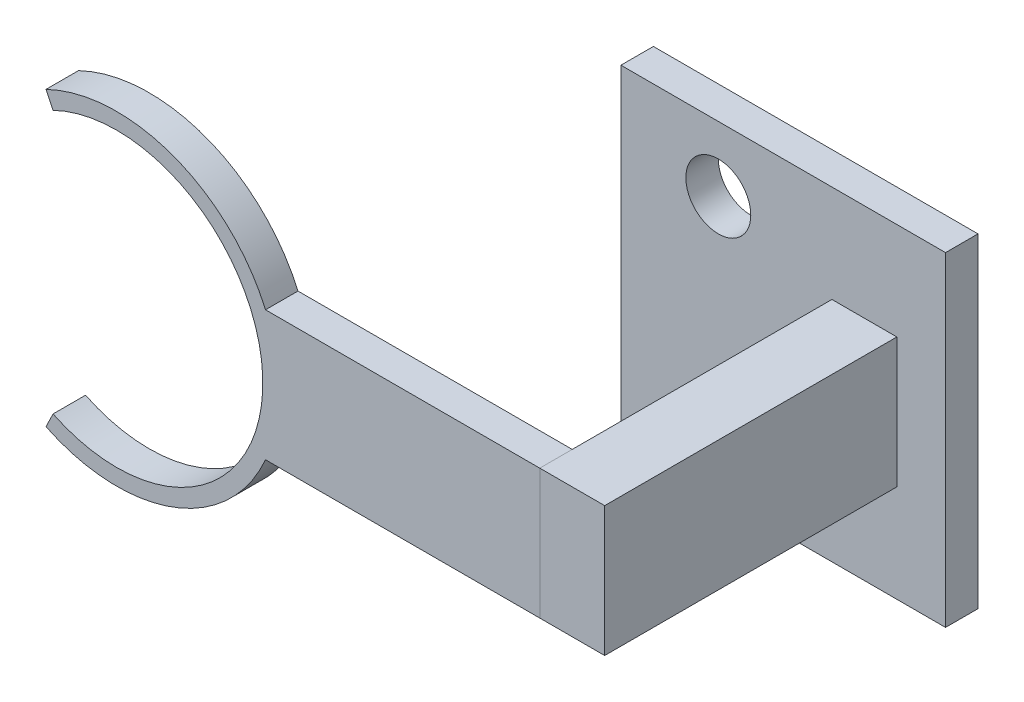
ISO-10303-21;
HEADER;
FILE_DESCRIPTION(('STEP AP214'),'2;1');
FILE_NAME('part.step','',(''),(''),'','','');
FILE_SCHEMA(('AUTOMOTIVE_DESIGN { 1 0 10303 214 1 1 1 1 }'));
ENDSEC;
DATA;
#1=APPLICATION_CONTEXT('core data for automotive mechanical design processes');
#2=APPLICATION_PROTOCOL_DEFINITION('international standard','automotive_design',2000,#1);
#3=PRODUCT_CONTEXT('',#1,'mechanical');
#4=PRODUCT('Part','Part','',(#3));
#5=PRODUCT_RELATED_PRODUCT_CATEGORY('part','',(#4));
#6=PRODUCT_DEFINITION_FORMATION('','',#4);
#7=PRODUCT_DEFINITION_CONTEXT('part definition',#1,'design');
#8=PRODUCT_DEFINITION('design','',#6,#7);
#9=PRODUCT_DEFINITION_SHAPE('','',#8);
#10=(LENGTH_UNIT() NAMED_UNIT(*) SI_UNIT(.MILLI.,.METRE.));
#11=(NAMED_UNIT(*) PLANE_ANGLE_UNIT() SI_UNIT($,.RADIAN.));
#12=(NAMED_UNIT(*) SI_UNIT($,.STERADIAN.) SOLID_ANGLE_UNIT());
#13=UNCERTAINTY_MEASURE_WITH_UNIT(LENGTH_MEASURE(1.E-05),#10,'distance_accuracy_value','');
#14=(GEOMETRIC_REPRESENTATION_CONTEXT(3) GLOBAL_UNCERTAINTY_ASSIGNED_CONTEXT((#13)) GLOBAL_UNIT_ASSIGNED_CONTEXT((#10,
#11,#12)) REPRESENTATION_CONTEXT('',''));
#15=CARTESIAN_POINT('',(0.,0.,0.));
#16=DIRECTION('',(0.,0.,1.));
#17=DIRECTION('',(1.,0.,0.));
#18=AXIS2_PLACEMENT_3D('',#15,#16,#17);
#19=CARTESIAN_POINT('',(-23.0622577482985,0.,18.));
#20=DIRECTION('',(0.,0.,1.));
#21=DIRECTION('',(1.,0.,0.));
#22=AXIS2_PLACEMENT_3D('',#19,#20,#21);
#23=CYLINDRICAL_SURFACE('',#22,9.);
#24=CARTESIAN_POINT('',(-23.0622577482985,0.,20.));
#25=DIRECTION('',(0.,0.,1.));
#26=DIRECTION('',(1.,0.,0.));
#27=AXIS2_PLACEMENT_3D('',#24,#25,#26);
#28=CIRCLE('',#27,9.);
#29=CARTESIAN_POINT('',(-26.9852667974851,-8.1,20.));
#30=VERTEX_POINT('',#29);
#31=CARTESIAN_POINT('',(-26.9852667974852,8.1,20.));
#32=VERTEX_POINT('',#31);
#33=EDGE_CURVE('E139',#30,#32,#28,.T.);
#34=ORIENTED_EDGE('',*,*,#33,.T.);
#35=DIRECTION('',(0.,0.,1.));
#36=VECTOR('',#35,1.);
#37=CARTESIAN_POINT('',(-26.9852667974852,8.1,18.));
#38=LINE('',#37,#36);
#39=CARTESIAN_POINT('',(-26.9852667974852,8.1,18.));
#40=VERTEX_POINT('',#39);
#41=EDGE_CURVE('E12',#40,#32,#38,.T.);
#42=ORIENTED_EDGE('',*,*,#41,.F.);
#43=CARTESIAN_POINT('',(-23.0622577482985,0.,18.));
#44=DIRECTION('',(0.,0.,1.));
#45=DIRECTION('',(1.,0.,0.));
#46=AXIS2_PLACEMENT_3D('',#43,#44,#45);
#47=CIRCLE('',#46,9.);
#48=CARTESIAN_POINT('',(-26.9852667974851,-8.1,18.));
#49=VERTEX_POINT('',#48);
#50=EDGE_CURVE('E157',#49,#40,#47,.T.);
#51=ORIENTED_EDGE('',*,*,#50,.F.);
#52=DIRECTION('',(0.,0.,1.));
#53=VECTOR('',#52,1.);
#54=CARTESIAN_POINT('',(-26.9852667974851,-8.1,18.));
#55=LINE('',#54,#53);
#56=EDGE_CURVE('E48',#49,#30,#55,.T.);
#57=ORIENTED_EDGE('',*,*,#56,.T.);
#58=EDGE_LOOP('',(#34,#42,#51,#57));
#59=FACE_BOUND('',#58,.T.);
#60=ADVANCED_FACE('F45',(#59),#23,.F.);
#61=CARTESIAN_POINT('',(-18.6804287761217,-9.04734458412496,18.));
#62=DIRECTION('',(0.899999999999998,0.435889894354072,0.));
#63=DIRECTION('',(-0.435889894354072,0.899999999999998,0.));
#64=AXIS2_PLACEMENT_3D('',#61,#62,#63);
#65=PLANE('',#64);
#66=DIRECTION('',(-0.435889894354072,0.899999999999998,0.));
#67=VECTOR('',#66,1.);
#68=CARTESIAN_POINT('',(-18.6804287761217,-9.04734458412496,20.));
#69=LINE('',#68,#67);
#70=CARTESIAN_POINT('',(-27.4211566918392,9.,20.));
#71=VERTEX_POINT('',#70);
#72=EDGE_CURVE('E96',#32,#71,#69,.T.);
#73=ORIENTED_EDGE('',*,*,#72,.T.);
#74=DIRECTION('',(0.,0.,1.));
#75=VECTOR('',#74,1.);
#76=CARTESIAN_POINT('',(-27.4211566918392,9.,18.));
#77=LINE('',#76,#75);
#78=CARTESIAN_POINT('',(-27.4211566918392,9.,18.));
#79=VERTEX_POINT('',#78);
#80=EDGE_CURVE('E54',#79,#71,#77,.T.);
#81=ORIENTED_EDGE('',*,*,#80,.F.);
#82=DIRECTION('',(-0.435889894354072,0.899999999999998,0.));
#83=VECTOR('',#82,1.);
#84=CARTESIAN_POINT('',(-18.6804287761217,-9.04734458412496,18.));
#85=LINE('',#84,#83);
#86=EDGE_CURVE('E62',#40,#79,#85,.T.);
#87=ORIENTED_EDGE('',*,*,#86,.F.);
#88=ORIENTED_EDGE('',*,*,#41,.T.);
#89=EDGE_LOOP('',(#73,#81,#87,#88));
#90=FACE_BOUND('',#89,.T.);
#91=ADVANCED_FACE('F182',(#90),#65,.F.);
#92=CARTESIAN_POINT('',(-23.0622577482985,0.,18.));
#93=DIRECTION('',(0.,0.,1.));
#94=DIRECTION('',(1.,0.,0.));
#95=AXIS2_PLACEMENT_3D('',#92,#93,#94);
#96=CYLINDRICAL_SURFACE('',#95,10.);
#97=CARTESIAN_POINT('',(-23.0622577482985,0.,20.));
#98=DIRECTION('',(0.,0.,1.));
#99=DIRECTION('',(1.,0.,0.));
#100=AXIS2_PLACEMENT_3D('',#97,#98,#99);
#101=CIRCLE('',#100,10.);
#102=CARTESIAN_POINT('',(-13.8971063583869,4.,20.));
#103=VERTEX_POINT('',#102);
#104=EDGE_CURVE('E121',#103,#71,#101,.T.);
#105=ORIENTED_EDGE('',*,*,#104,.F.);
#106=DIRECTION('',(0.,0.,1.));
#107=VECTOR('',#106,1.);
#108=CARTESIAN_POINT('',(-13.8971063583869,4.,18.));
#109=LINE('',#108,#107);
#110=CARTESIAN_POINT('',(-13.8971063583869,4.,18.));
#111=VERTEX_POINT('',#110);
#112=EDGE_CURVE('E116',#111,#103,#109,.T.);
#113=ORIENTED_EDGE('',*,*,#112,.F.);
#114=CARTESIAN_POINT('',(-23.0622577482985,0.,18.));
#115=DIRECTION('',(0.,0.,1.));
#116=DIRECTION('',(1.,0.,0.));
#117=AXIS2_PLACEMENT_3D('',#114,#115,#116);
#118=CIRCLE('',#117,10.);
#119=EDGE_CURVE('E120',#111,#79,#118,.T.);
#120=ORIENTED_EDGE('',*,*,#119,.T.);
#121=ORIENTED_EDGE('',*,*,#80,.T.);
#122=EDGE_LOOP('',(#105,#113,#120,#121));
#123=FACE_BOUND('',#122,.T.);
#124=ADVANCED_FACE('F118',(#123),#96,.T.);
#125=CARTESIAN_POINT('',(0.,4.,18.));
#126=DIRECTION('',(0.,-1.,0.));
#127=DIRECTION('',(1.,0.,0.));
#128=AXIS2_PLACEMENT_3D('',#125,#126,#127);
#129=PLANE('',#128);
#130=DIRECTION('',(1.,0.,0.));
#131=VECTOR('',#130,1.);
#132=CARTESIAN_POINT('',(0.,4.,20.));
#133=LINE('',#132,#131);
#134=CARTESIAN_POINT('',(3.,4.,20.));
#135=VERTEX_POINT('',#134);
#136=EDGE_CURVE('E154',#103,#135,#133,.T.);
#137=ORIENTED_EDGE('',*,*,#136,.T.);
#138=DIRECTION('',(0.,0.,1.));
#139=VECTOR('',#138,1.);
#140=CARTESIAN_POINT('',(3.,4.,18.));
#141=LINE('',#140,#139);
#142=CARTESIAN_POINT('',(3.,4.,18.));
#143=VERTEX_POINT('',#142);
#144=EDGE_CURVE('E124',#143,#135,#141,.T.);
#145=ORIENTED_EDGE('',*,*,#144,.F.);
#146=DIRECTION('',(1.,0.,0.));
#147=VECTOR('',#146,1.);
#148=CARTESIAN_POINT('',(0.,4.,18.));
#149=LINE('',#148,#147);
#150=EDGE_CURVE('E127',#111,#143,#149,.T.);
#151=ORIENTED_EDGE('',*,*,#150,.F.);
#152=ORIENTED_EDGE('',*,*,#112,.T.);
#153=EDGE_LOOP('',(#137,#145,#151,#152));
#154=FACE_BOUND('',#153,.T.);
#155=ADVANCED_FACE('F128',(#154),#129,.F.);
#156=CARTESIAN_POINT('',(3.,0.,18.));
#157=DIRECTION('',(-1.,0.,0.));
#158=DIRECTION('',(0.,-1.,0.));
#159=AXIS2_PLACEMENT_3D('',#156,#157,#158);
#160=PLANE('',#159);
#161=DIRECTION('',(0.,-1.,0.));
#162=VECTOR('',#161,1.);
#163=CARTESIAN_POINT('',(3.,0.,20.));
#164=LINE('',#163,#162);
#165=CARTESIAN_POINT('',(3.,-4.,20.));
#166=VERTEX_POINT('',#165);
#167=EDGE_CURVE('E151',#135,#166,#164,.T.);
#168=ORIENTED_EDGE('',*,*,#167,.T.);
#169=DIRECTION('',(0.,0.,1.));
#170=VECTOR('',#169,1.);
#171=CARTESIAN_POINT('',(3.,-4.,18.));
#172=LINE('',#171,#170);
#173=CARTESIAN_POINT('',(3.,-4.,18.));
#174=VERTEX_POINT('',#173);
#175=EDGE_CURVE('E161',#174,#166,#172,.T.);
#176=ORIENTED_EDGE('',*,*,#175,.F.);
#177=DIRECTION('',(0.,-1.,0.));
#178=VECTOR('',#177,1.);
#179=CARTESIAN_POINT('',(3.,0.,18.));
#180=LINE('',#179,#178);
#181=EDGE_CURVE('E132',#143,#174,#180,.T.);
#182=ORIENTED_EDGE('',*,*,#181,.F.);
#183=ORIENTED_EDGE('',*,*,#144,.T.);
#184=EDGE_LOOP('',(#168,#176,#182,#183));
#185=FACE_BOUND('',#184,.T.);
#186=ADVANCED_FACE('F195',(#185),#160,.F.);
#187=CARTESIAN_POINT('',(0.,-4.,18.));
#188=DIRECTION('',(0.,-1.,0.));
#189=DIRECTION('',(0.,0.,-1.));
#190=AXIS2_PLACEMENT_3D('',#187,#188,#189);
#191=PLANE('',#190);
#192=DIRECTION('',(1.,0.,0.));
#193=VECTOR('',#192,1.);
#194=CARTESIAN_POINT('',(0.,-4.,20.));
#195=LINE('',#194,#193);
#196=CARTESIAN_POINT('',(-13.8971063583869,-4.,20.));
#197=VERTEX_POINT('',#196);
#198=EDGE_CURVE('E148',#197,#166,#195,.T.);
#199=ORIENTED_EDGE('',*,*,#198,.F.);
#200=DIRECTION('',(0.,0.,1.));
#201=VECTOR('',#200,1.);
#202=CARTESIAN_POINT('',(-13.8971063583869,-4.,18.));
#203=LINE('',#202,#201);
#204=CARTESIAN_POINT('',(-13.8971063583869,-4.,18.));
#205=VERTEX_POINT('',#204);
#206=EDGE_CURVE('E163',#205,#197,#203,.T.);
#207=ORIENTED_EDGE('',*,*,#206,.F.);
#208=DIRECTION('',(1.,0.,0.));
#209=VECTOR('',#208,1.);
#210=CARTESIAN_POINT('',(0.,-4.,18.));
#211=LINE('',#210,#209);
#212=EDGE_CURVE('E211',#205,#174,#211,.T.);
#213=ORIENTED_EDGE('',*,*,#212,.T.);
#214=ORIENTED_EDGE('',*,*,#175,.T.);
#215=EDGE_LOOP('',(#199,#207,#213,#214));
#216=FACE_BOUND('',#215,.T.);
#217=ADVANCED_FACE('F178',(#216),#191,.T.);
#218=CARTESIAN_POINT('',(-23.0622577482985,0.,18.));
#219=DIRECTION('',(0.,0.,1.));
#220=DIRECTION('',(1.,0.,0.));
#221=AXIS2_PLACEMENT_3D('',#218,#219,#220);
#222=CYLINDRICAL_SURFACE('',#221,10.);
#223=CARTESIAN_POINT('',(-23.0622577482985,0.,20.));
#224=DIRECTION('',(0.,0.,1.));
#225=DIRECTION('',(1.,0.,0.));
#226=AXIS2_PLACEMENT_3D('',#223,#224,#225);
#227=CIRCLE('',#226,10.);
#228=CARTESIAN_POINT('',(-27.4211566918392,-9.,20.));
#229=VERTEX_POINT('',#228);
#230=EDGE_CURVE('E145',#229,#197,#227,.T.);
#231=ORIENTED_EDGE('',*,*,#230,.F.);
#232=DIRECTION('',(0.,0.,1.));
#233=VECTOR('',#232,1.);
#234=CARTESIAN_POINT('',(-27.4211566918392,-9.,18.));
#235=LINE('',#234,#233);
#236=CARTESIAN_POINT('',(-27.4211566918392,-9.,18.));
#237=VERTEX_POINT('',#236);
#238=EDGE_CURVE('E164',#237,#229,#235,.T.);
#239=ORIENTED_EDGE('',*,*,#238,.F.);
#240=CARTESIAN_POINT('',(-23.0622577482985,0.,18.));
#241=DIRECTION('',(0.,0.,1.));
#242=DIRECTION('',(1.,0.,0.));
#243=AXIS2_PLACEMENT_3D('',#240,#241,#242);
#244=CIRCLE('',#243,10.);
#245=EDGE_CURVE('E210',#237,#205,#244,.T.);
#246=ORIENTED_EDGE('',*,*,#245,.T.);
#247=ORIENTED_EDGE('',*,*,#206,.T.);
#248=EDGE_LOOP('',(#231,#239,#246,#247));
#249=FACE_BOUND('',#248,.T.);
#250=ADVANCED_FACE('F172',(#249),#222,.T.);
#251=CARTESIAN_POINT('',(-18.6804287761217,9.04734458412495,18.));
#252=DIRECTION('',(-0.899999999999998,0.435889894354071,0.));
#253=DIRECTION('',(-0.435889894354071,-0.899999999999998,0.));
#254=AXIS2_PLACEMENT_3D('',#251,#252,#253);
#255=PLANE('',#254);
#256=DIRECTION('',(-0.435889894354071,-0.899999999999998,0.));
#257=VECTOR('',#256,1.);
#258=CARTESIAN_POINT('',(-18.6804287761217,9.04734458412495,20.));
#259=LINE('',#258,#257);
#260=EDGE_CURVE('E142',#30,#229,#259,.T.);
#261=ORIENTED_EDGE('',*,*,#260,.F.);
#262=ORIENTED_EDGE('',*,*,#56,.F.);
#263=DIRECTION('',(-0.435889894354071,-0.899999999999998,0.));
#264=VECTOR('',#263,1.);
#265=CARTESIAN_POINT('',(-18.6804287761217,9.04734458412495,18.));
#266=LINE('',#265,#264);
#267=EDGE_CURVE('E212',#49,#237,#266,.T.);
#268=ORIENTED_EDGE('',*,*,#267,.T.);
#269=ORIENTED_EDGE('',*,*,#238,.T.);
#270=EDGE_LOOP('',(#261,#262,#268,#269));
#271=FACE_BOUND('',#270,.T.);
#272=ADVANCED_FACE('F170',(#271),#255,.T.);
#273=CARTESIAN_POINT('',(0.,0.,18.));
#274=DIRECTION('',(0.,0.,1.));
#275=DIRECTION('',(1.,0.,0.));
#276=AXIS2_PLACEMENT_3D('',#273,#274,#275);
#277=PLANE('',#276);
#278=ORIENTED_EDGE('',*,*,#50,.T.);
#279=ORIENTED_EDGE('',*,*,#86,.T.);
#280=ORIENTED_EDGE('',*,*,#119,.F.);
#281=ORIENTED_EDGE('',*,*,#150,.T.);
#282=ORIENTED_EDGE('',*,*,#181,.T.);
#283=ORIENTED_EDGE('',*,*,#212,.F.);
#284=ORIENTED_EDGE('',*,*,#245,.F.);
#285=ORIENTED_EDGE('',*,*,#267,.F.);
#286=EDGE_LOOP('',(#278,#279,#280,#281,#282,#283,#284,#285));
#287=FACE_BOUND('',#286,.T.);
#288=ADVANCED_FACE('F134',(#287),#277,.F.);
#289=CARTESIAN_POINT('',(0.,0.,20.));
#290=DIRECTION('',(0.,0.,1.));
#291=DIRECTION('',(1.,0.,0.));
#292=AXIS2_PLACEMENT_3D('',#289,#290,#291);
#293=PLANE('',#292);
#294=ORIENTED_EDGE('',*,*,#33,.F.);
#295=ORIENTED_EDGE('',*,*,#260,.T.);
#296=ORIENTED_EDGE('',*,*,#230,.T.);
#297=ORIENTED_EDGE('',*,*,#198,.T.);
#298=ORIENTED_EDGE('',*,*,#167,.F.);
#299=ORIENTED_EDGE('',*,*,#136,.F.);
#300=ORIENTED_EDGE('',*,*,#104,.T.);
#301=ORIENTED_EDGE('',*,*,#72,.F.);
#302=EDGE_LOOP('',(#294,#295,#296,#297,#298,#299,#300,#301));
#303=FACE_BOUND('',#302,.T.);
#304=ADVANCED_FACE('F169',(#303),#293,.T.);
#305=CLOSED_SHELL('',(#60,#91,#124,#155,#186,#217,#250,#272,#288,#304));
#306=MANIFOLD_SOLID_BREP('B2',#305);
#307=CARTESIAN_POINT('',(0.,0.,2.));
#308=DIRECTION('',(0.,0.,-1.));
#309=DIRECTION('',(-1.,0.,0.));
#310=AXIS2_PLACEMENT_3D('',#307,#308,#309);
#311=PLANE('',#310);
#312=CARTESIAN_POINT('',(-4.,-6.,2.));
#313=DIRECTION('',(0.,0.,1.));
#314=DIRECTION('',(-1.,0.,0.));
#315=AXIS2_PLACEMENT_3D('',#312,#313,#314);
#316=CIRCLE('',#315,2.);
#317=CARTESIAN_POINT('',(-6.,-6.,2.));
#318=VERTEX_POINT('',#317);
#319=EDGE_CURVE('E396',#318,#318,#316,.T.);
#320=ORIENTED_EDGE('',*,*,#319,.F.);
#321=EDGE_LOOP('',(#320));
#322=FACE_BOUND('',#321,.T.);
#323=CARTESIAN_POINT('',(-4.00000000000001,6.,2.));
#324=DIRECTION('',(0.,0.,1.));
#325=DIRECTION('',(1.,0.,0.));
#326=AXIS2_PLACEMENT_3D('',#323,#324,#325);
#327=CIRCLE('',#326,2.);
#328=CARTESIAN_POINT('',(-2.00000000000001,6.,2.));
#329=VERTEX_POINT('',#328);
#330=EDGE_CURVE('E405',#329,#329,#327,.T.);
#331=ORIENTED_EDGE('',*,*,#330,.F.);
#332=EDGE_LOOP('',(#331));
#333=FACE_BOUND('',#332,.T.);
#334=DIRECTION('',(0.,-1.,0.));
#335=VECTOR('',#334,1.);
#336=CARTESIAN_POINT('',(-10.,10.,2.));
#337=LINE('',#336,#335);
#338=CARTESIAN_POINT('',(-10.,10.,2.));
#339=VERTEX_POINT('',#338);
#340=CARTESIAN_POINT('',(-10.,-10.,2.));
#341=VERTEX_POINT('',#340);
#342=EDGE_CURVE('E411',#339,#341,#337,.T.);
#343=ORIENTED_EDGE('',*,*,#342,.T.);
#344=DIRECTION('',(1.,0.,0.));
#345=VECTOR('',#344,1.);
#346=CARTESIAN_POINT('',(10.,-9.99999999999999,2.));
#347=LINE('',#346,#345);
#348=CARTESIAN_POINT('',(10.,-9.99999999999999,2.));
#349=VERTEX_POINT('',#348);
#350=EDGE_CURVE('E346',#341,#349,#347,.T.);
#351=ORIENTED_EDGE('',*,*,#350,.T.);
#352=DIRECTION('',(0.,1.,0.));
#353=VECTOR('',#352,1.);
#354=CARTESIAN_POINT('',(10.,10.,2.));
#355=LINE('',#354,#353);
#356=CARTESIAN_POINT('',(10.,10.,2.));
#357=VERTEX_POINT('',#356);
#358=EDGE_CURVE('E414',#349,#357,#355,.T.);
#359=ORIENTED_EDGE('',*,*,#358,.T.);
#360=DIRECTION('',(-1.,0.,0.));
#361=VECTOR('',#360,1.);
#362=CARTESIAN_POINT('',(10.,10.,2.));
#363=LINE('',#362,#361);
#364=EDGE_CURVE('E318',#357,#339,#363,.T.);
#365=ORIENTED_EDGE('',*,*,#364,.T.);
#366=EDGE_LOOP('',(#343,#351,#359,#365));
#367=FACE_BOUND('',#366,.T.);
#368=DIRECTION('',(-1.,0.,0.));
#369=VECTOR('',#368,1.);
#370=CARTESIAN_POINT('',(0.,4.,2.));
#371=LINE('',#370,#369);
#372=CARTESIAN_POINT('',(7.,4.,2.));
#373=VERTEX_POINT('',#372);
#374=CARTESIAN_POINT('',(3.,4.,2.));
#375=VERTEX_POINT('',#374);
#376=EDGE_CURVE('E391',#373,#375,#371,.T.);
#377=ORIENTED_EDGE('',*,*,#376,.F.);
#378=DIRECTION('',(0.,-1.,0.));
#379=VECTOR('',#378,1.);
#380=CARTESIAN_POINT('',(7.,0.,2.));
#381=LINE('',#380,#379);
#382=CARTESIAN_POINT('',(7.,-4.,2.));
#383=VERTEX_POINT('',#382);
#384=EDGE_CURVE('E387',#373,#383,#381,.T.);
#385=ORIENTED_EDGE('',*,*,#384,.T.);
#386=DIRECTION('',(-1.,0.,0.));
#387=VECTOR('',#386,1.);
#388=CARTESIAN_POINT('',(0.,-4.,2.));
#389=LINE('',#388,#387);
#390=CARTESIAN_POINT('',(3.,-4.,2.));
#391=VERTEX_POINT('',#390);
#392=EDGE_CURVE('E309',#383,#391,#389,.T.);
#393=ORIENTED_EDGE('',*,*,#392,.T.);
#394=DIRECTION('',(0.,-1.,0.));
#395=VECTOR('',#394,1.);
#396=CARTESIAN_POINT('',(3.,0.,2.));
#397=LINE('',#396,#395);
#398=EDGE_CURVE('E560',#375,#391,#397,.T.);
#399=ORIENTED_EDGE('',*,*,#398,.F.);
#400=EDGE_LOOP('',(#377,#385,#393,#399));
#401=FACE_BOUND('',#400,.T.);
#402=ADVANCED_FACE('F294',(#322,#333,#367,#401),#311,.F.);
#403=CARTESIAN_POINT('',(0.,0.,0.));
#404=DIRECTION('',(0.,0.,-1.));
#405=DIRECTION('',(-1.,0.,0.));
#406=AXIS2_PLACEMENT_3D('',#403,#404,#405);
#407=PLANE('',#406);
#408=CARTESIAN_POINT('',(-4.00000000000001,6.,0.));
#409=DIRECTION('',(0.,0.,1.));
#410=DIRECTION('',(1.,0.,0.));
#411=AXIS2_PLACEMENT_3D('',#408,#409,#410);
#412=CIRCLE('',#411,2.);
#413=CARTESIAN_POINT('',(-2.00000000000001,6.,0.));
#414=VERTEX_POINT('',#413);
#415=EDGE_CURVE('E403',#414,#414,#412,.T.);
#416=ORIENTED_EDGE('',*,*,#415,.T.);
#417=EDGE_LOOP('',(#416));
#418=FACE_BOUND('',#417,.T.);
#419=DIRECTION('',(0.,-1.,0.));
#420=VECTOR('',#419,1.);
#421=CARTESIAN_POINT('',(-10.,10.,0.));
#422=LINE('',#421,#420);
#423=CARTESIAN_POINT('',(-10.,10.,0.));
#424=VERTEX_POINT('',#423);
#425=CARTESIAN_POINT('',(-10.,-10.,0.));
#426=VERTEX_POINT('',#425);
#427=EDGE_CURVE('E408',#424,#426,#422,.T.);
#428=ORIENTED_EDGE('',*,*,#427,.F.);
#429=DIRECTION('',(-1.,0.,0.));
#430=VECTOR('',#429,1.);
#431=CARTESIAN_POINT('',(10.,10.,0.));
#432=LINE('',#431,#430);
#433=CARTESIAN_POINT('',(10.,10.,0.));
#434=VERTEX_POINT('',#433);
#435=EDGE_CURVE('E339',#434,#424,#432,.T.);
#436=ORIENTED_EDGE('',*,*,#435,.F.);
#437=DIRECTION('',(0.,1.,0.));
#438=VECTOR('',#437,1.);
#439=CARTESIAN_POINT('',(10.,10.,0.));
#440=LINE('',#439,#438);
#441=CARTESIAN_POINT('',(10.,-9.99999999999999,0.));
#442=VERTEX_POINT('',#441);
#443=EDGE_CURVE('E422',#442,#434,#440,.T.);
#444=ORIENTED_EDGE('',*,*,#443,.F.);
#445=DIRECTION('',(1.,0.,0.));
#446=VECTOR('',#445,1.);
#447=CARTESIAN_POINT('',(10.,-9.99999999999999,0.));
#448=LINE('',#447,#446);
#449=EDGE_CURVE('E420',#426,#442,#448,.T.);
#450=ORIENTED_EDGE('',*,*,#449,.F.);
#451=EDGE_LOOP('',(#428,#436,#444,#450));
#452=FACE_BOUND('',#451,.T.);
#453=CARTESIAN_POINT('',(-4.,-6.,0.));
#454=DIRECTION('',(0.,0.,1.));
#455=DIRECTION('',(-1.,0.,0.));
#456=AXIS2_PLACEMENT_3D('',#453,#454,#455);
#457=CIRCLE('',#456,2.);
#458=CARTESIAN_POINT('',(-6.,-6.,0.));
#459=VERTEX_POINT('',#458);
#460=EDGE_CURVE('E393',#459,#459,#457,.T.);
#461=ORIENTED_EDGE('',*,*,#460,.T.);
#462=EDGE_LOOP('',(#461));
#463=FACE_BOUND('',#462,.T.);
#464=ADVANCED_FACE('F435',(#418,#452,#463),#407,.T.);
#465=CARTESIAN_POINT('',(-10.,10.,2.));
#466=DIRECTION('',(1.,0.,0.));
#467=DIRECTION('',(0.,1.,0.));
#468=AXIS2_PLACEMENT_3D('',#465,#466,#467);
#469=PLANE('',#468);
#470=ORIENTED_EDGE('',*,*,#427,.T.);
#471=DIRECTION('',(0.,0.,-1.));
#472=VECTOR('',#471,1.);
#473=CARTESIAN_POINT('',(-10.,-10.,2.));
#474=LINE('',#473,#472);
#475=EDGE_CURVE('E43',#341,#426,#474,.T.);
#476=ORIENTED_EDGE('',*,*,#475,.F.);
#477=ORIENTED_EDGE('',*,*,#342,.F.);
#478=DIRECTION('',(0.,0.,-1.));
#479=VECTOR('',#478,1.);
#480=CARTESIAN_POINT('',(-10.,10.,2.));
#481=LINE('',#480,#479);
#482=EDGE_CURVE('E417',#339,#424,#481,.T.);
#483=ORIENTED_EDGE('',*,*,#482,.T.);
#484=EDGE_LOOP('',(#470,#476,#477,#483));
#485=FACE_BOUND('',#484,.T.);
#486=ADVANCED_FACE('F296',(#485),#469,.F.);
#487=CARTESIAN_POINT('',(10.,-9.99999999999999,2.));
#488=DIRECTION('',(0.,1.,0.));
#489=DIRECTION('',(-1.,0.,0.));
#490=AXIS2_PLACEMENT_3D('',#487,#488,#489);
#491=PLANE('',#490);
#492=ORIENTED_EDGE('',*,*,#449,.T.);
#493=DIRECTION('',(0.,0.,-1.));
#494=VECTOR('',#493,1.);
#495=CARTESIAN_POINT('',(10.,-9.99999999999999,2.));
#496=LINE('',#495,#494);
#497=EDGE_CURVE('E302',#349,#442,#496,.T.);
#498=ORIENTED_EDGE('',*,*,#497,.F.);
#499=ORIENTED_EDGE('',*,*,#350,.F.);
#500=ORIENTED_EDGE('',*,*,#475,.T.);
#501=EDGE_LOOP('',(#492,#498,#499,#500));
#502=FACE_BOUND('',#501,.T.);
#503=ADVANCED_FACE('F451',(#502),#491,.F.);
#504=CARTESIAN_POINT('',(10.,10.,2.));
#505=DIRECTION('',(-1.,0.,0.));
#506=DIRECTION('',(0.,-1.,0.));
#507=AXIS2_PLACEMENT_3D('',#504,#505,#506);
#508=PLANE('',#507);
#509=ORIENTED_EDGE('',*,*,#443,.T.);
#510=DIRECTION('',(0.,0.,-1.));
#511=VECTOR('',#510,1.);
#512=CARTESIAN_POINT('',(10.,10.,2.));
#513=LINE('',#512,#511);
#514=EDGE_CURVE('E426',#357,#434,#513,.T.);
#515=ORIENTED_EDGE('',*,*,#514,.F.);
#516=ORIENTED_EDGE('',*,*,#358,.F.);
#517=ORIENTED_EDGE('',*,*,#497,.T.);
#518=EDGE_LOOP('',(#509,#515,#516,#517));
#519=FACE_BOUND('',#518,.T.);
#520=ADVANCED_FACE('F431',(#519),#508,.F.);
#521=CARTESIAN_POINT('',(10.,10.,2.));
#522=DIRECTION('',(0.,-1.,0.));
#523=DIRECTION('',(1.,0.,0.));
#524=AXIS2_PLACEMENT_3D('',#521,#522,#523);
#525=PLANE('',#524);
#526=ORIENTED_EDGE('',*,*,#435,.T.);
#527=ORIENTED_EDGE('',*,*,#482,.F.);
#528=ORIENTED_EDGE('',*,*,#364,.F.);
#529=ORIENTED_EDGE('',*,*,#514,.T.);
#530=EDGE_LOOP('',(#526,#527,#528,#529));
#531=FACE_BOUND('',#530,.T.);
#532=ADVANCED_FACE('F440',(#531),#525,.F.);
#533=CARTESIAN_POINT('',(-4.00000000000001,6.,2.));
#534=DIRECTION('',(0.,0.,-1.));
#535=DIRECTION('',(-1.,0.,0.));
#536=AXIS2_PLACEMENT_3D('',#533,#534,#535);
#537=CYLINDRICAL_SURFACE('',#536,2.);
#538=ORIENTED_EDGE('',*,*,#330,.T.);
#539=EDGE_LOOP('',(#538));
#540=FACE_BOUND('',#539,.T.);
#541=ORIENTED_EDGE('',*,*,#415,.F.);
#542=EDGE_LOOP('',(#541));
#543=FACE_BOUND('',#542,.T.);
#544=ADVANCED_FACE('F442',(#540,#543),#537,.F.);
#545=CARTESIAN_POINT('',(-4.,-6.,2.));
#546=DIRECTION('',(0.,0.,-1.));
#547=DIRECTION('',(-1.,0.,0.));
#548=AXIS2_PLACEMENT_3D('',#545,#546,#547);
#549=CYLINDRICAL_SURFACE('',#548,2.);
#550=ORIENTED_EDGE('',*,*,#319,.T.);
#551=EDGE_LOOP('',(#550));
#552=FACE_BOUND('',#551,.T.);
#553=ORIENTED_EDGE('',*,*,#460,.F.);
#554=EDGE_LOOP('',(#553));
#555=FACE_BOUND('',#554,.T.);
#556=ADVANCED_FACE('F448',(#552,#555),#549,.F.);
#557=CARTESIAN_POINT('',(0.,4.,20.));
#558=DIRECTION('',(0.,-1.,0.));
#559=DIRECTION('',(1.,0.,0.));
#560=AXIS2_PLACEMENT_3D('',#557,#558,#559);
#561=PLANE('',#560);
#562=ORIENTED_EDGE('',*,*,#376,.T.);
#563=DIRECTION('',(0.,0.,-1.));
#564=VECTOR('',#563,1.);
#565=CARTESIAN_POINT('',(3.,4.,20.));
#566=LINE('',#565,#564);
#567=CARTESIAN_POINT('',(3.,4.,20.));
#568=VERTEX_POINT('',#567);
#569=EDGE_CURVE('E372',#568,#375,#566,.T.);
#570=ORIENTED_EDGE('',*,*,#569,.F.);
#571=DIRECTION('',(-1.,0.,0.));
#572=VECTOR('',#571,1.);
#573=CARTESIAN_POINT('',(0.,4.,20.));
#574=LINE('',#573,#572);
#575=CARTESIAN_POINT('',(7.,4.,20.));
#576=VERTEX_POINT('',#575);
#577=EDGE_CURVE('E379',#576,#568,#574,.T.);
#578=ORIENTED_EDGE('',*,*,#577,.F.);
#579=DIRECTION('',(0.,0.,-1.));
#580=VECTOR('',#579,1.);
#581=CARTESIAN_POINT('',(7.,4.,20.));
#582=LINE('',#581,#580);
#583=EDGE_CURVE('E557',#576,#373,#582,.T.);
#584=ORIENTED_EDGE('',*,*,#583,.T.);
#585=EDGE_LOOP('',(#562,#570,#578,#584));
#586=FACE_BOUND('',#585,.T.);
#587=ADVANCED_FACE('F389',(#586),#561,.F.);
#588=CARTESIAN_POINT('',(3.,0.,20.));
#589=DIRECTION('',(1.,0.,0.));
#590=DIRECTION('',(0.,1.,0.));
#591=AXIS2_PLACEMENT_3D('',#588,#589,#590);
#592=PLANE('',#591);
#593=ORIENTED_EDGE('',*,*,#398,.T.);
#594=DIRECTION('',(0.,0.,-1.));
#595=VECTOR('',#594,1.);
#596=CARTESIAN_POINT('',(3.,-4.,20.));
#597=LINE('',#596,#595);
#598=CARTESIAN_POINT('',(3.,-4.,20.));
#599=VERTEX_POINT('',#598);
#600=EDGE_CURVE('E374',#599,#391,#597,.T.);
#601=ORIENTED_EDGE('',*,*,#600,.F.);
#602=DIRECTION('',(0.,-1.,0.));
#603=VECTOR('',#602,1.);
#604=CARTESIAN_POINT('',(3.,0.,20.));
#605=LINE('',#604,#603);
#606=EDGE_CURVE('E367',#568,#599,#605,.T.);
#607=ORIENTED_EDGE('',*,*,#606,.F.);
#608=ORIENTED_EDGE('',*,*,#569,.T.);
#609=EDGE_LOOP('',(#593,#601,#607,#608));
#610=FACE_BOUND('',#609,.T.);
#611=ADVANCED_FACE('F370',(#610),#592,.F.);
#612=CARTESIAN_POINT('',(0.,-4.,20.));
#613=DIRECTION('',(0.,-1.,0.));
#614=DIRECTION('',(1.,0.,0.));
#615=AXIS2_PLACEMENT_3D('',#612,#613,#614);
#616=PLANE('',#615);
#617=ORIENTED_EDGE('',*,*,#392,.F.);
#618=DIRECTION('',(0.,0.,-1.));
#619=VECTOR('',#618,1.);
#620=CARTESIAN_POINT('',(7.,-4.,20.));
#621=LINE('',#620,#619);
#622=CARTESIAN_POINT('',(7.,-4.,20.));
#623=VERTEX_POINT('',#622);
#624=EDGE_CURVE('E398',#623,#383,#621,.T.);
#625=ORIENTED_EDGE('',*,*,#624,.F.);
#626=DIRECTION('',(-1.,0.,0.));
#627=VECTOR('',#626,1.);
#628=CARTESIAN_POINT('',(0.,-4.,20.));
#629=LINE('',#628,#627);
#630=EDGE_CURVE('E378',#623,#599,#629,.T.);
#631=ORIENTED_EDGE('',*,*,#630,.T.);
#632=ORIENTED_EDGE('',*,*,#600,.T.);
#633=EDGE_LOOP('',(#617,#625,#631,#632));
#634=FACE_BOUND('',#633,.T.);
#635=ADVANCED_FACE('F471',(#634),#616,.T.);
#636=CARTESIAN_POINT('',(7.,0.,20.));
#637=DIRECTION('',(1.,0.,0.));
#638=DIRECTION('',(0.,1.,0.));
#639=AXIS2_PLACEMENT_3D('',#636,#637,#638);
#640=PLANE('',#639);
#641=ORIENTED_EDGE('',*,*,#384,.F.);
#642=ORIENTED_EDGE('',*,*,#583,.F.);
#643=DIRECTION('',(0.,-1.,0.));
#644=VECTOR('',#643,1.);
#645=CARTESIAN_POINT('',(7.,0.,20.));
#646=LINE('',#645,#644);
#647=EDGE_CURVE('E385',#576,#623,#646,.T.);
#648=ORIENTED_EDGE('',*,*,#647,.T.);
#649=ORIENTED_EDGE('',*,*,#624,.T.);
#650=EDGE_LOOP('',(#641,#642,#648,#649));
#651=FACE_BOUND('',#650,.T.);
#652=ADVANCED_FACE('F474',(#651),#640,.T.);
#653=CARTESIAN_POINT('',(0.,0.,20.));
#654=DIRECTION('',(0.,0.,1.));
#655=DIRECTION('',(1.,0.,0.));
#656=AXIS2_PLACEMENT_3D('',#653,#654,#655);
#657=PLANE('',#656);
#658=ORIENTED_EDGE('',*,*,#577,.T.);
#659=ORIENTED_EDGE('',*,*,#606,.T.);
#660=ORIENTED_EDGE('',*,*,#630,.F.);
#661=ORIENTED_EDGE('',*,*,#647,.F.);
#662=EDGE_LOOP('',(#658,#659,#660,#661));
#663=FACE_BOUND('',#662,.T.);
#664=ADVANCED_FACE('F383',(#663),#657,.T.);
#665=CLOSED_SHELL('',(#402,#464,#486,#503,#520,#532,#544,#556,#587,#611,#635,#652,#664));
#666=MANIFOLD_SOLID_BREP('B6',#665);
#667=ADVANCED_BREP_SHAPE_REPRESENTATION('',(#18,#306,#666),#14);
#668=SHAPE_DEFINITION_REPRESENTATION(#9,#667);
ENDSEC;
END-ISO-10303-21;
